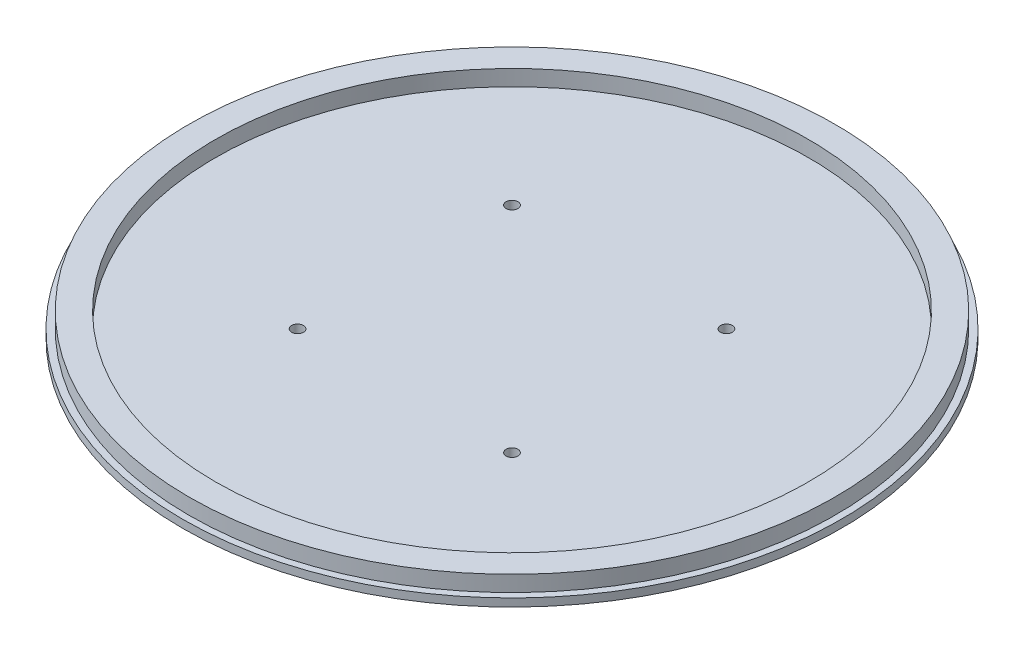
ISO-10303-21;
HEADER;
FILE_DESCRIPTION(('STEP AP214'),'2;1');
FILE_NAME('part.step','',(''),(''),'','','');
FILE_SCHEMA(('AUTOMOTIVE_DESIGN { 1 0 10303 214 1 1 1 1 }'));
ENDSEC;
DATA;
#1=APPLICATION_CONTEXT('core data for automotive mechanical design processes');
#2=APPLICATION_PROTOCOL_DEFINITION('international standard','automotive_design',2000,#1);
#3=PRODUCT_CONTEXT('',#1,'mechanical');
#4=PRODUCT('Part','Part','',(#3));
#5=PRODUCT_RELATED_PRODUCT_CATEGORY('part','',(#4));
#6=PRODUCT_DEFINITION_FORMATION('','',#4);
#7=PRODUCT_DEFINITION_CONTEXT('part definition',#1,'design');
#8=PRODUCT_DEFINITION('design','',#6,#7);
#9=PRODUCT_DEFINITION_SHAPE('','',#8);
#10=(LENGTH_UNIT() NAMED_UNIT(*) SI_UNIT(.MILLI.,.METRE.));
#11=(NAMED_UNIT(*) PLANE_ANGLE_UNIT() SI_UNIT($,.RADIAN.));
#12=(NAMED_UNIT(*) SI_UNIT($,.STERADIAN.) SOLID_ANGLE_UNIT());
#13=UNCERTAINTY_MEASURE_WITH_UNIT(LENGTH_MEASURE(1.E-05),#10,'distance_accuracy_value','');
#14=(GEOMETRIC_REPRESENTATION_CONTEXT(3) GLOBAL_UNCERTAINTY_ASSIGNED_CONTEXT((#13)) GLOBAL_UNIT_ASSIGNED_CONTEXT((#10,
#11,#12)) REPRESENTATION_CONTEXT('',''));
#15=CARTESIAN_POINT('',(0.,0.,0.));
#16=DIRECTION('',(0.,0.,1.));
#17=DIRECTION('',(1.,0.,0.));
#18=AXIS2_PLACEMENT_3D('',#15,#16,#17);
#19=CARTESIAN_POINT('',(0.,0.,0.));
#20=DIRECTION('',(0.,1.,0.));
#21=DIRECTION('',(0.,0.,0.999999999999998));
#22=AXIS2_PLACEMENT_3D('',#19,#20,#21);
#23=PLANE('',#22);
#24=DIRECTION('',(-0.999999999999998,0.,0.));
#25=VECTOR('',#24,1.);
#26=CARTESIAN_POINT('',(0.,0.,16.4160797830999));
#27=LINE('',#26,#25);
#28=CARTESIAN_POINT('',(-91.5160797831002,0.,16.4160797830997));
#29=VERTEX_POINT('',#28);
#30=CARTESIAN_POINT('',(-58.6839202169002,0.,16.4160797831014));
#31=VERTEX_POINT('',#30);
#32=EDGE_CURVE('E237',#29,#31,#27,.F.);
#33=ORIENTED_EDGE('',*,*,#32,.T.);
#34=DIRECTION('',(0.,0.,0.999999999999998));
#35=VECTOR('',#34,1.);
#36=CARTESIAN_POINT('',(-58.6839202169003,0.,8.88178419700125E-13));
#37=LINE('',#36,#35);
#38=CARTESIAN_POINT('',(-58.6839202169005,-9.43689570931383E-13,-16.4160797830979));
#39=VERTEX_POINT('',#38);
#40=EDGE_CURVE('E239',#31,#39,#37,.F.);
#41=ORIENTED_EDGE('',*,*,#40,.T.);
#42=DIRECTION('',(-0.999999999999998,0.,0.));
#43=VECTOR('',#42,1.);
#44=CARTESIAN_POINT('',(-1.66533453693773E-13,-8.88178419700125E-13,-16.4160797830992));
#45=LINE('',#44,#43);
#46=CARTESIAN_POINT('',(-91.5160797830992,-9.43689570931383E-13,-16.4160797830981));
#47=VERTEX_POINT('',#46);
#48=EDGE_CURVE('E220',#39,#47,#45,.T.);
#49=ORIENTED_EDGE('',*,*,#48,.T.);
#50=DIRECTION('',(0.,0.,0.999999999999998));
#51=VECTOR('',#50,1.);
#52=CARTESIAN_POINT('',(-91.5160797831001,-1.66533453693773E-13,1.77635683940025E-12));
#53=LINE('',#52,#51);
#54=EDGE_CURVE('E235',#47,#29,#53,.T.);
#55=ORIENTED_EDGE('',*,*,#54,.T.);
#56=EDGE_LOOP('',(#33,#41,#49,#55));
#57=FACE_BOUND('',#56,.T.);
#58=CARTESIAN_POINT('',(0.,0.,0.));
#59=DIRECTION('',(0.,1.,0.));
#60=DIRECTION('',(0.,0.,0.999999999999998));
#61=AXIS2_PLACEMENT_3D('',#58,#59,#60);
#62=CIRCLE('',#61,125.);
#63=CARTESIAN_POINT('',(0.,0.,125.));
#64=VERTEX_POINT('',#63);
#65=EDGE_CURVE('E193',#64,#64,#62,.T.);
#66=ORIENTED_EDGE('',*,*,#65,.F.);
#67=EDGE_LOOP('',(#66));
#68=FACE_BOUND('',#67,.T.);
#69=DIRECTION('',(0.,0.,-0.999999999999998));
#70=VECTOR('',#69,1.);
#71=CARTESIAN_POINT('',(50.2499999999999,-8.88178419700125E-13,1.78329573330416E-12));
#72=LINE('',#71,#70);
#73=CARTESIAN_POINT('',(50.2499999999996,0.,50.2500000000015));
#74=VERTEX_POINT('',#73);
#75=CARTESIAN_POINT('',(50.25,-9.43689570931383E-13,-50.2499999999995));
#76=VERTEX_POINT('',#75);
#77=EDGE_CURVE('E209',#74,#76,#72,.T.);
#78=ORIENTED_EDGE('',*,*,#77,.T.);
#79=DIRECTION('',(0.999999999999998,0.,0.));
#80=VECTOR('',#79,1.);
#81=CARTESIAN_POINT('',(-47.2499999999999,-8.88178419700125E-13,-50.2499999999983));
#82=LINE('',#81,#80);
#83=CARTESIAN_POINT('',(-50.2499999999999,-8.88178419700125E-13,-50.249999999999));
#84=VERTEX_POINT('',#83);
#85=EDGE_CURVE('E211',#76,#84,#82,.F.);
#86=ORIENTED_EDGE('',*,*,#85,.T.);
#87=DIRECTION('',(0.,0.,-0.999999999999998));
#88=VECTOR('',#87,1.);
#89=CARTESIAN_POINT('',(-50.2500000000002,0.,47.25));
#90=LINE('',#89,#88);
#91=CARTESIAN_POINT('',(-50.2499999999999,0.,50.2500000000001));
#92=VERTEX_POINT('',#91);
#93=EDGE_CURVE('E205',#84,#92,#90,.F.);
#94=ORIENTED_EDGE('',*,*,#93,.T.);
#95=DIRECTION('',(0.999999999999998,0.,0.));
#96=VECTOR('',#95,1.);
#97=CARTESIAN_POINT('',(-1.11022302462516E-13,0.,50.2500000000012));
#98=LINE('',#97,#96);
#99=EDGE_CURVE('E207',#92,#74,#98,.T.);
#100=ORIENTED_EDGE('',*,*,#99,.T.);
#101=EDGE_LOOP('',(#78,#86,#94,#100));
#102=FACE_BOUND('',#101,.T.);
#103=ADVANCED_FACE('F59',(#57,#68,#102),#23,.F.);
#104=CARTESIAN_POINT('',(-2.22044604925031E-13,3.,0.));
#105=DIRECTION('',(0.,-1.,0.));
#106=DIRECTION('',(0.,0.,-0.999999999999998));
#107=AXIS2_PLACEMENT_3D('',#104,#105,#106);
#108=CYLINDRICAL_SURFACE('',#107,125.);
#109=CARTESIAN_POINT('',(-2.22044604925031E-13,3.,0.));
#110=DIRECTION('',(0.,1.,0.));
#111=DIRECTION('',(0.,0.,0.999999999999998));
#112=AXIS2_PLACEMENT_3D('',#109,#110,#111);
#113=CIRCLE('',#112,125.);
#114=CARTESIAN_POINT('',(-2.20309881449055E-13,3.,125.));
#115=VERTEX_POINT('',#114);
#116=EDGE_CURVE('E196',#115,#115,#113,.T.);
#117=ORIENTED_EDGE('',*,*,#116,.F.);
#118=EDGE_LOOP('',(#117));
#119=FACE_BOUND('',#118,.T.);
#120=ORIENTED_EDGE('',*,*,#65,.T.);
#121=EDGE_LOOP('',(#120));
#122=FACE_BOUND('',#121,.T.);
#123=ADVANCED_FACE('F312',(#119,#122),#108,.T.);
#124=CARTESIAN_POINT('',(-2.22044604925031E-13,3.,0.));
#125=DIRECTION('',(0.,1.,0.));
#126=DIRECTION('',(0.,0.,0.999999999999998));
#127=AXIS2_PLACEMENT_3D('',#124,#125,#126);
#128=PLANE('',#127);
#129=CARTESIAN_POINT('',(-2.22044604925031E-13,3.,0.));
#130=DIRECTION('',(0.,1.,0.));
#131=DIRECTION('',(0.,0.,0.999999999999998));
#132=AXIS2_PLACEMENT_3D('',#129,#130,#131);
#133=CIRCLE('',#132,122.5);
#134=CARTESIAN_POINT('',(-2.20344575918574E-13,3.,122.5));
#135=VERTEX_POINT('',#134);
#136=EDGE_CURVE('E189',#135,#135,#133,.T.);
#137=ORIENTED_EDGE('',*,*,#136,.F.);
#138=EDGE_LOOP('',(#137));
#139=FACE_BOUND('',#138,.T.);
#140=ORIENTED_EDGE('',*,*,#116,.T.);
#141=EDGE_LOOP('',(#140));
#142=FACE_BOUND('',#141,.T.);
#143=ADVANCED_FACE('F319',(#139,#142),#128,.T.);
#144=CARTESIAN_POINT('',(2.22044604925031E-13,9.00000000000001,0.));
#145=DIRECTION('',(0.,1.,0.));
#146=DIRECTION('',(0.,0.,0.999999999999998));
#147=AXIS2_PLACEMENT_3D('',#144,#145,#146);
#148=PLANE('',#147);
#149=CARTESIAN_POINT('',(2.22044604925031E-13,9.00000000000001,0.));
#150=DIRECTION('',(0.,1.,0.));
#151=DIRECTION('',(0.,0.,0.999999999999998));
#152=AXIS2_PLACEMENT_3D('',#149,#150,#151);
#153=CIRCLE('',#152,122.5);
#154=CARTESIAN_POINT('',(2.23744633931489E-13,9.00000000000001,122.5));
#155=VERTEX_POINT('',#154);
#156=EDGE_CURVE('E190',#155,#155,#153,.T.);
#157=ORIENTED_EDGE('',*,*,#156,.T.);
#158=EDGE_LOOP('',(#157));
#159=FACE_BOUND('',#158,.T.);
#160=CARTESIAN_POINT('',(2.22044604925031E-13,9.00000000000001,0.));
#161=DIRECTION('',(0.,1.,0.));
#162=DIRECTION('',(0.,0.,0.999999999999998));
#163=AXIS2_PLACEMENT_3D('',#160,#161,#162);
#164=CIRCLE('',#163,112.5);
#165=CARTESIAN_POINT('',(2.2360585605341E-13,9.00000000000001,112.5));
#166=VERTEX_POINT('',#165);
#167=EDGE_CURVE('E170',#166,#166,#164,.T.);
#168=ORIENTED_EDGE('',*,*,#167,.F.);
#169=EDGE_LOOP('',(#168));
#170=FACE_BOUND('',#169,.T.);
#171=ADVANCED_FACE('F475',(#159,#170),#148,.T.);
#172=CARTESIAN_POINT('',(2.22044604925031E-13,9.00000000000001,0.));
#173=DIRECTION('',(0.,-1.,0.));
#174=DIRECTION('',(0.,0.,-0.999999999999998));
#175=AXIS2_PLACEMENT_3D('',#172,#173,#174);
#176=CYLINDRICAL_SURFACE('',#175,122.5);
#177=ORIENTED_EDGE('',*,*,#156,.F.);
#178=EDGE_LOOP('',(#177));
#179=FACE_BOUND('',#178,.T.);
#180=ORIENTED_EDGE('',*,*,#136,.T.);
#181=EDGE_LOOP('',(#180));
#182=FACE_BOUND('',#181,.T.);
#183=ADVANCED_FACE('F467',(#179,#182),#176,.T.);
#184=CARTESIAN_POINT('',(2.22044604925031E-13,9.00000000000001,0.));
#185=DIRECTION('',(0.,-1.,0.));
#186=DIRECTION('',(0.,0.,-0.999999999999998));
#187=AXIS2_PLACEMENT_3D('',#184,#185,#186);
#188=CYLINDRICAL_SURFACE('',#187,112.5);
#189=ORIENTED_EDGE('',*,*,#167,.T.);
#190=EDGE_LOOP('',(#189));
#191=FACE_BOUND('',#190,.T.);
#192=CARTESIAN_POINT('',(-2.22044604925031E-13,3.,0.));
#193=DIRECTION('',(0.,1.,0.));
#194=DIRECTION('',(0.,0.,0.999999999999998));
#195=AXIS2_PLACEMENT_3D('',#192,#193,#194);
#196=CIRCLE('',#195,112.5);
#197=CARTESIAN_POINT('',(-2.20483353796652E-13,3.,112.5));
#198=VERTEX_POINT('',#197);
#199=EDGE_CURVE('E199',#198,#198,#196,.F.);
#200=ORIENTED_EDGE('',*,*,#199,.T.);
#201=EDGE_LOOP('',(#200));
#202=FACE_BOUND('',#201,.T.);
#203=ADVANCED_FACE('F464',(#191,#202),#188,.F.);
#204=CARTESIAN_POINT('',(-40.6600000000003,2.99999999999911,-40.6599999999999));
#205=DIRECTION('',(0.,1.,0.));
#206=DIRECTION('',(0.,0.,0.999999999999998));
#207=AXIS2_PLACEMENT_3D('',#204,#205,#206);
#208=CIRCLE('',#207,2.25);
#209=CARTESIAN_POINT('',(-40.6600000000003,2.99999999999911,-38.4099999999999));
#210=VERTEX_POINT('',#209);
#211=EDGE_CURVE('E522',#210,#210,#208,.T.);
#212=ORIENTED_EDGE('',*,*,#211,.F.);
#213=EDGE_LOOP('',(#212));
#214=FACE_BOUND('',#213,.T.);
#215=CARTESIAN_POINT('',(-40.6600000000001,3.,40.6600000000019));
#216=DIRECTION('',(0.,1.,0.));
#217=DIRECTION('',(0.,0.,0.999999999999998));
#218=AXIS2_PLACEMENT_3D('',#215,#216,#217);
#219=CIRCLE('',#218,2.25);
#220=CARTESIAN_POINT('',(-40.6600000000001,3.,42.9100000000019));
#221=VERTEX_POINT('',#220);
#222=EDGE_CURVE('E526',#221,#221,#219,.T.);
#223=ORIENTED_EDGE('',*,*,#222,.F.);
#224=EDGE_LOOP('',(#223));
#225=FACE_BOUND('',#224,.T.);
#226=CARTESIAN_POINT('',(40.6599999999995,3.,40.6599999999997));
#227=DIRECTION('',(0.,1.,0.));
#228=DIRECTION('',(0.,0.,0.999999999999998));
#229=AXIS2_PLACEMENT_3D('',#226,#227,#228);
#230=CIRCLE('',#229,2.25);
#231=CARTESIAN_POINT('',(40.6599999999995,3.,42.9099999999997));
#232=VERTEX_POINT('',#231);
#233=EDGE_CURVE('E530',#232,#232,#230,.T.);
#234=ORIENTED_EDGE('',*,*,#233,.F.);
#235=EDGE_LOOP('',(#234));
#236=FACE_BOUND('',#235,.T.);
#237=CARTESIAN_POINT('',(40.6599999999999,2.99999999999923,-40.6599999999984));
#238=DIRECTION('',(0.,1.,0.));
#239=DIRECTION('',(0.,0.,0.999999999999998));
#240=AXIS2_PLACEMENT_3D('',#237,#238,#239);
#241=CIRCLE('',#240,2.25);
#242=CARTESIAN_POINT('',(40.6599999999999,2.99999999999923,-38.4099999999984));
#243=VERTEX_POINT('',#242);
#244=EDGE_CURVE('E161',#243,#243,#241,.T.);
#245=ORIENTED_EDGE('',*,*,#244,.F.);
#246=EDGE_LOOP('',(#245));
#247=FACE_BOUND('',#246,.T.);
#248=ORIENTED_EDGE('',*,*,#199,.F.);
#249=EDGE_LOOP('',(#248));
#250=FACE_BOUND('',#249,.T.);
#251=ADVANCED_FACE('F459',(#214,#225,#236,#247,#250),#128,.T.);
#252=CARTESIAN_POINT('',(-47.2499999999997,-8.0000000000009,-47.25));
#253=DIRECTION('',(0.,0.,0.999999999999998));
#254=DIRECTION('',(0.999999999999998,0.,0.));
#255=AXIS2_PLACEMENT_3D('',#252,#253,#254);
#256=PLANE('',#255);
#257=DIRECTION('',(0.,1.,0.));
#258=VECTOR('',#257,1.);
#259=CARTESIAN_POINT('',(-47.2499999999997,-8.0000000000009,-47.25));
#260=LINE('',#259,#258);
#261=CARTESIAN_POINT('',(-47.2499999999997,-8.0000000000009,-47.25));
#262=VERTEX_POINT('',#261);
#263=CARTESIAN_POINT('',(-47.2499999999995,-3.00000000000089,-47.2499999999998));
#264=VERTEX_POINT('',#263);
#265=EDGE_CURVE('E181',#262,#264,#260,.T.);
#266=ORIENTED_EDGE('',*,*,#265,.T.);
#267=DIRECTION('',(0.999999999999998,0.,0.));
#268=VECTOR('',#267,1.);
#269=CARTESIAN_POINT('',(47.25,-3.00000000000095,-47.2499999999993));
#270=LINE('',#269,#268);
#271=CARTESIAN_POINT('',(47.25,-3.00000000000095,-47.2499999999993));
#272=VERTEX_POINT('',#271);
#273=EDGE_CURVE('E168',#264,#272,#270,.T.);
#274=ORIENTED_EDGE('',*,*,#273,.T.);
#275=DIRECTION('',(0.,1.,0.));
#276=VECTOR('',#275,1.);
#277=CARTESIAN_POINT('',(47.2499999999998,-8.00000000000095,-47.2499999999991));
#278=LINE('',#277,#276);
#279=CARTESIAN_POINT('',(47.2499999999998,-8.00000000000095,-47.2499999999991));
#280=VERTEX_POINT('',#279);
#281=EDGE_CURVE('E165',#280,#272,#278,.T.);
#282=ORIENTED_EDGE('',*,*,#281,.F.);
#283=DIRECTION('',(0.999999999999998,0.,0.));
#284=VECTOR('',#283,1.);
#285=CARTESIAN_POINT('',(-47.2499999999997,-8.0000000000009,-47.25));
#286=LINE('',#285,#284);
#287=EDGE_CURVE('E149',#262,#280,#286,.T.);
#288=ORIENTED_EDGE('',*,*,#287,.F.);
#289=EDGE_LOOP('',(#266,#274,#282,#288));
#290=FACE_BOUND('',#289,.T.);
#291=ADVANCED_FACE('F166',(#290),#256,.F.);
#292=CARTESIAN_POINT('',(47.25,-8.00000000000001,47.25));
#293=DIRECTION('',(0.999999999999998,0.,0.));
#294=DIRECTION('',(0.,0.,-0.999999999999998));
#295=AXIS2_PLACEMENT_3D('',#292,#293,#294);
#296=PLANE('',#295);
#297=ORIENTED_EDGE('',*,*,#281,.T.);
#298=DIRECTION('',(0.,0.,-0.999999999999998));
#299=VECTOR('',#298,1.);
#300=CARTESIAN_POINT('',(47.2500000000002,-3.,47.2500000000002));
#301=LINE('',#300,#299);
#302=CARTESIAN_POINT('',(47.2500000000002,-3.,47.2500000000002));
#303=VERTEX_POINT('',#302);
#304=EDGE_CURVE('E214',#272,#303,#301,.F.);
#305=ORIENTED_EDGE('',*,*,#304,.T.);
#306=DIRECTION('',(0.,1.,0.));
#307=VECTOR('',#306,1.);
#308=CARTESIAN_POINT('',(47.25,-8.00000000000001,47.25));
#309=LINE('',#308,#307);
#310=CARTESIAN_POINT('',(47.25,-8.00000000000001,47.25));
#311=VERTEX_POINT('',#310);
#312=EDGE_CURVE('E171',#311,#303,#309,.T.);
#313=ORIENTED_EDGE('',*,*,#312,.F.);
#314=DIRECTION('',(0.,0.,-0.999999999999998));
#315=VECTOR('',#314,1.);
#316=CARTESIAN_POINT('',(47.25,-8.00000000000001,47.25));
#317=LINE('',#316,#315);
#318=EDGE_CURVE('E154',#311,#280,#317,.T.);
#319=ORIENTED_EDGE('',*,*,#318,.T.);
#320=EDGE_LOOP('',(#297,#305,#313,#319));
#321=FACE_BOUND('',#320,.T.);
#322=ADVANCED_FACE('F173',(#321),#296,.T.);
#323=CARTESIAN_POINT('',(-47.25,-8.00000000000001,47.2500000000002));
#324=DIRECTION('',(0.,0.,0.999999999999998));
#325=DIRECTION('',(0.999999999999998,0.,0.));
#326=AXIS2_PLACEMENT_3D('',#323,#324,#325);
#327=PLANE('',#326);
#328=ORIENTED_EDGE('',*,*,#312,.T.);
#329=DIRECTION('',(0.999999999999998,0.,0.));
#330=VECTOR('',#329,1.);
#331=CARTESIAN_POINT('',(-47.2499999999996,-3.,47.25));
#332=LINE('',#331,#330);
#333=CARTESIAN_POINT('',(-47.2499999999996,-3.,47.25));
#334=VERTEX_POINT('',#333);
#335=EDGE_CURVE('E216',#303,#334,#332,.F.);
#336=ORIENTED_EDGE('',*,*,#335,.T.);
#337=DIRECTION('',(0.,1.,0.));
#338=VECTOR('',#337,1.);
#339=CARTESIAN_POINT('',(-47.25,-8.00000000000001,47.2500000000002));
#340=LINE('',#339,#338);
#341=CARTESIAN_POINT('',(-47.25,-8.00000000000001,47.2500000000002));
#342=VERTEX_POINT('',#341);
#343=EDGE_CURVE('E183',#342,#334,#340,.T.);
#344=ORIENTED_EDGE('',*,*,#343,.F.);
#345=DIRECTION('',(0.999999999999998,0.,0.));
#346=VECTOR('',#345,1.);
#347=CARTESIAN_POINT('',(-47.25,-8.00000000000001,47.2500000000002));
#348=LINE('',#347,#346);
#349=EDGE_CURVE('E175',#342,#311,#348,.T.);
#350=ORIENTED_EDGE('',*,*,#349,.T.);
#351=EDGE_LOOP('',(#328,#336,#344,#350));
#352=FACE_BOUND('',#351,.T.);
#353=ADVANCED_FACE('F438',(#352),#327,.T.);
#354=CARTESIAN_POINT('',(-47.25,-8.00000000000001,47.2500000000002));
#355=DIRECTION('',(0.999999999999998,0.,0.));
#356=DIRECTION('',(0.,0.,-0.999999999999998));
#357=AXIS2_PLACEMENT_3D('',#354,#355,#356);
#358=PLANE('',#357);
#359=ORIENTED_EDGE('',*,*,#343,.T.);
#360=DIRECTION('',(0.,0.,-0.999999999999998));
#361=VECTOR('',#360,1.);
#362=CARTESIAN_POINT('',(-47.2499999999995,-3.00000000000089,-47.2499999999998));
#363=LINE('',#362,#361);
#364=EDGE_CURVE('E218',#334,#264,#363,.T.);
#365=ORIENTED_EDGE('',*,*,#364,.T.);
#366=ORIENTED_EDGE('',*,*,#265,.F.);
#367=DIRECTION('',(0.,0.,-0.999999999999998));
#368=VECTOR('',#367,1.);
#369=CARTESIAN_POINT('',(-47.25,-8.00000000000001,47.2500000000002));
#370=LINE('',#369,#368);
#371=EDGE_CURVE('E157',#342,#262,#370,.T.);
#372=ORIENTED_EDGE('',*,*,#371,.F.);
#373=EDGE_LOOP('',(#359,#365,#366,#372));
#374=FACE_BOUND('',#373,.T.);
#375=ADVANCED_FACE('F430',(#374),#358,.F.);
#376=CARTESIAN_POINT('',(0.,-8.00000000000001,0.));
#377=DIRECTION('',(0.,1.,0.));
#378=DIRECTION('',(0.,0.,0.999999999999998));
#379=AXIS2_PLACEMENT_3D('',#376,#377,#378);
#380=PLANE('',#379);
#381=CARTESIAN_POINT('',(-40.6600000000003,-8.0000000000009,-40.6599999999999));
#382=DIRECTION('',(0.,-1.,0.));
#383=DIRECTION('',(0.,0.,-0.999999999999998));
#384=AXIS2_PLACEMENT_3D('',#381,#382,#383);
#385=CIRCLE('',#384,2.25);
#386=CARTESIAN_POINT('',(-40.6600000000003,-8.0000000000009,-42.9099999999999));
#387=VERTEX_POINT('',#386);
#388=EDGE_CURVE('E232',#387,#387,#385,.T.);
#389=ORIENTED_EDGE('',*,*,#388,.F.);
#390=EDGE_LOOP('',(#389));
#391=FACE_BOUND('',#390,.T.);
#392=CARTESIAN_POINT('',(-40.6599999999998,-8.00000000000001,40.6600000000019));
#393=DIRECTION('',(0.,-1.,0.));
#394=DIRECTION('',(0.,0.,-0.999999999999998));
#395=AXIS2_PLACEMENT_3D('',#392,#393,#394);
#396=CIRCLE('',#395,2.25);
#397=CARTESIAN_POINT('',(-40.6599999999998,-8.00000000000001,38.4100000000019));
#398=VERTEX_POINT('',#397);
#399=EDGE_CURVE('E545',#398,#398,#396,.T.);
#400=ORIENTED_EDGE('',*,*,#399,.F.);
#401=EDGE_LOOP('',(#400));
#402=FACE_BOUND('',#401,.T.);
#403=CARTESIAN_POINT('',(40.6599999999996,-8.00000000000001,40.6599999999997));
#404=DIRECTION('',(0.,-1.,0.));
#405=DIRECTION('',(0.,0.,-0.999999999999998));
#406=AXIS2_PLACEMENT_3D('',#403,#404,#405);
#407=CIRCLE('',#406,2.25);
#408=CARTESIAN_POINT('',(40.6599999999996,-8.00000000000001,38.4099999999997));
#409=VERTEX_POINT('',#408);
#410=EDGE_CURVE('E541',#409,#409,#407,.T.);
#411=ORIENTED_EDGE('',*,*,#410,.F.);
#412=EDGE_LOOP('',(#411));
#413=FACE_BOUND('',#412,.T.);
#414=CARTESIAN_POINT('',(40.6600000000002,-8.00000000000079,-40.6599999999986));
#415=DIRECTION('',(0.,-1.,0.));
#416=DIRECTION('',(0.,0.,-0.999999999999998));
#417=AXIS2_PLACEMENT_3D('',#414,#415,#416);
#418=CIRCLE('',#417,2.25);
#419=CARTESIAN_POINT('',(40.6600000000002,-8.00000000000079,-42.9099999999986));
#420=VERTEX_POINT('',#419);
#421=EDGE_CURVE('E536',#420,#420,#418,.T.);
#422=ORIENTED_EDGE('',*,*,#421,.F.);
#423=EDGE_LOOP('',(#422));
#424=FACE_BOUND('',#423,.T.);
#425=ORIENTED_EDGE('',*,*,#287,.T.);
#426=ORIENTED_EDGE('',*,*,#318,.F.);
#427=ORIENTED_EDGE('',*,*,#349,.F.);
#428=ORIENTED_EDGE('',*,*,#371,.T.);
#429=EDGE_LOOP('',(#425,#426,#427,#428));
#430=FACE_BOUND('',#429,.T.);
#431=ADVANCED_FACE('F151',(#391,#402,#413,#424,#430),#380,.F.);
#432=CARTESIAN_POINT('',(40.6600000000002,-8.00000000000079,-40.6599999999986));
#433=DIRECTION('',(0.,-1.,0.));
#434=DIRECTION('',(0.,0.,-0.999999999999998));
#435=AXIS2_PLACEMENT_3D('',#432,#433,#434);
#436=CYLINDRICAL_SURFACE('',#435,2.25);
#437=ORIENTED_EDGE('',*,*,#244,.T.);
#438=EDGE_LOOP('',(#437));
#439=FACE_BOUND('',#438,.T.);
#440=ORIENTED_EDGE('',*,*,#421,.T.);
#441=EDGE_LOOP('',(#440));
#442=FACE_BOUND('',#441,.T.);
#443=ADVANCED_FACE('F414',(#439,#442),#436,.F.);
#444=CARTESIAN_POINT('',(40.6599999999996,-8.00000000000001,40.6599999999997));
#445=DIRECTION('',(0.,-1.,0.));
#446=DIRECTION('',(0.,0.,-0.999999999999998));
#447=AXIS2_PLACEMENT_3D('',#444,#445,#446);
#448=CYLINDRICAL_SURFACE('',#447,2.25);
#449=ORIENTED_EDGE('',*,*,#233,.T.);
#450=EDGE_LOOP('',(#449));
#451=FACE_BOUND('',#450,.T.);
#452=ORIENTED_EDGE('',*,*,#410,.T.);
#453=EDGE_LOOP('',(#452));
#454=FACE_BOUND('',#453,.T.);
#455=ADVANCED_FACE('F405',(#451,#454),#448,.F.);
#456=CARTESIAN_POINT('',(-40.6599999999998,-8.00000000000001,40.6600000000019));
#457=DIRECTION('',(0.,-1.,0.));
#458=DIRECTION('',(0.,0.,-0.999999999999998));
#459=AXIS2_PLACEMENT_3D('',#456,#457,#458);
#460=CYLINDRICAL_SURFACE('',#459,2.25);
#461=ORIENTED_EDGE('',*,*,#222,.T.);
#462=EDGE_LOOP('',(#461));
#463=FACE_BOUND('',#462,.T.);
#464=ORIENTED_EDGE('',*,*,#399,.T.);
#465=EDGE_LOOP('',(#464));
#466=FACE_BOUND('',#465,.T.);
#467=ADVANCED_FACE('F397',(#463,#466),#460,.F.);
#468=CARTESIAN_POINT('',(-40.6600000000003,-8.0000000000009,-40.6599999999999));
#469=DIRECTION('',(0.,-1.,0.));
#470=DIRECTION('',(0.,0.,-0.999999999999998));
#471=AXIS2_PLACEMENT_3D('',#468,#469,#470);
#472=CYLINDRICAL_SURFACE('',#471,2.25);
#473=ORIENTED_EDGE('',*,*,#211,.T.);
#474=EDGE_LOOP('',(#473));
#475=FACE_BOUND('',#474,.T.);
#476=ORIENTED_EDGE('',*,*,#388,.T.);
#477=EDGE_LOOP('',(#476));
#478=FACE_BOUND('',#477,.T.);
#479=ADVANCED_FACE('F336',(#475,#478),#472,.F.);
#480=CARTESIAN_POINT('',(3.88578058618805E-13,-3.,50.250000000001));
#481=DIRECTION('',(0.999999999999998,0.,0.));
#482=DIRECTION('',(0.,0.,-0.999999999999998));
#483=AXIS2_PLACEMENT_3D('',#480,#481,#482);
#484=CYLINDRICAL_SURFACE('',#483,3.);
#485=CARTESIAN_POINT('',(50.2499999999999,-3.,50.2500000000017));
#486=DIRECTION('',(0.707106781186547,0.,-0.707106781186547));
#487=DIRECTION('',(0.707106781186547,0.,0.707106781186547));
#488=AXIS2_PLACEMENT_3D('',#485,#486,#487);
#489=ELLIPSE('',#488,4.24264068711928,3.);
#490=EDGE_CURVE('E226',#74,#303,#489,.F.);
#491=ORIENTED_EDGE('',*,*,#490,.F.);
#492=ORIENTED_EDGE('',*,*,#99,.F.);
#493=CARTESIAN_POINT('',(-50.2499999999994,-3.,50.2500000000001));
#494=DIRECTION('',(0.707106781186547,0.,0.707106781186547));
#495=DIRECTION('',(-0.707106781186547,0.,0.707106781186547));
#496=AXIS2_PLACEMENT_3D('',#493,#494,#495);
#497=ELLIPSE('',#496,4.24264068711929,3.);
#498=EDGE_CURVE('E229',#334,#92,#497,.T.);
#499=ORIENTED_EDGE('',*,*,#498,.F.);
#500=ORIENTED_EDGE('',*,*,#335,.F.);
#501=EDGE_LOOP('',(#491,#492,#499,#500));
#502=FACE_BOUND('',#501,.T.);
#503=ADVANCED_FACE('F332',(#502),#484,.F.);
#504=CARTESIAN_POINT('',(-50.2499999999998,-3.,47.25));
#505=DIRECTION('',(0.,0.,0.999999999999998));
#506=DIRECTION('',(0.999999999999998,0.,0.));
#507=AXIS2_PLACEMENT_3D('',#504,#505,#506);
#508=CYLINDRICAL_SURFACE('',#507,3.);
#509=ORIENTED_EDGE('',*,*,#498,.T.);
#510=ORIENTED_EDGE('',*,*,#93,.F.);
#511=CARTESIAN_POINT('',(-50.2499999999992,-3.00000000000089,-50.249999999999));
#512=DIRECTION('',(-0.707106781186547,0.,0.707106781186547));
#513=DIRECTION('',(0.707106781186547,0.,0.707106781186547));
#514=AXIS2_PLACEMENT_3D('',#511,#512,#513);
#515=ELLIPSE('',#514,4.24264068711928,3.);
#516=EDGE_CURVE('E223',#264,#84,#515,.T.);
#517=ORIENTED_EDGE('',*,*,#516,.F.);
#518=ORIENTED_EDGE('',*,*,#364,.F.);
#519=EDGE_LOOP('',(#509,#510,#517,#518));
#520=FACE_BOUND('',#519,.T.);
#521=ADVANCED_FACE('F328',(#520),#508,.F.);
#522=CARTESIAN_POINT('',(50.2500000000001,-3.00000000000089,1.79023462720806E-12));
#523=DIRECTION('',(0.,0.,-0.999999999999998));
#524=DIRECTION('',(-0.999999999999998,0.,0.));
#525=AXIS2_PLACEMENT_3D('',#522,#523,#524);
#526=CYLINDRICAL_SURFACE('',#525,3.);
#527=ORIENTED_EDGE('',*,*,#490,.T.);
#528=ORIENTED_EDGE('',*,*,#304,.F.);
#529=CARTESIAN_POINT('',(50.2500000000005,-3.00000000000095,-50.2499999999997));
#530=DIRECTION('',(-0.707106781186547,0.,-0.707106781186547));
#531=DIRECTION('',(0.707106781186547,0.,-0.707106781186547));
#532=AXIS2_PLACEMENT_3D('',#529,#530,#531);
#533=ELLIPSE('',#532,4.24264068711929,3.);
#534=EDGE_CURVE('E221',#76,#272,#533,.F.);
#535=ORIENTED_EDGE('',*,*,#534,.F.);
#536=ORIENTED_EDGE('',*,*,#77,.F.);
#537=EDGE_LOOP('',(#527,#528,#535,#536));
#538=FACE_BOUND('',#537,.T.);
#539=ADVANCED_FACE('F308',(#538),#526,.F.);
#540=CARTESIAN_POINT('',(-47.2499999999997,-3.00000000000089,-50.2499999999986));
#541=DIRECTION('',(-0.999999999999998,0.,0.));
#542=DIRECTION('',(0.,0.,0.999999999999998));
#543=AXIS2_PLACEMENT_3D('',#540,#541,#542);
#544=CYLINDRICAL_SURFACE('',#543,3.);
#545=ORIENTED_EDGE('',*,*,#516,.T.);
#546=ORIENTED_EDGE('',*,*,#85,.F.);
#547=ORIENTED_EDGE('',*,*,#534,.T.);
#548=ORIENTED_EDGE('',*,*,#273,.F.);
#549=EDGE_LOOP('',(#545,#546,#547,#548));
#550=FACE_BOUND('',#549,.T.);
#551=ADVANCED_FACE('F298',(#550),#544,.F.);
#552=CARTESIAN_POINT('',(4.9960036108132E-13,-5.,0.));
#553=DIRECTION('',(0.,1.,0.));
#554=DIRECTION('',(0.,0.,0.999999999999998));
#555=AXIS2_PLACEMENT_3D('',#552,#553,#554);
#556=PLANE('',#555);
#557=DIRECTION('',(-0.999999999999998,0.,0.));
#558=VECTOR('',#557,1.);
#559=CARTESIAN_POINT('',(2.22044604925031E-13,-5.,0.137259187001464));
#560=LINE('',#559,#558);
#561=CARTESIAN_POINT('',(-74.9627408129998,-5.00000000000006,0.137259186999923));
#562=VERTEX_POINT('',#561);
#563=CARTESIAN_POINT('',(-75.2372591869994,-5.00000000000006,0.137259187001471));
#564=VERTEX_POINT('',#563);
#565=EDGE_CURVE('E242',#562,#564,#560,.T.);
#566=ORIENTED_EDGE('',*,*,#565,.T.);
#567=DIRECTION('',(0.,0.,0.999999999999998));
#568=VECTOR('',#567,1.);
#569=CARTESIAN_POINT('',(-75.2372591869998,-5.00000000000006,1.55431223447522E-12));
#570=LINE('',#569,#568);
#571=CARTESIAN_POINT('',(-75.2372591869999,-5.00000000000006,-0.137259186999909));
#572=VERTEX_POINT('',#571);
#573=EDGE_CURVE('E255',#564,#572,#570,.F.);
#574=ORIENTED_EDGE('',*,*,#573,.T.);
#575=DIRECTION('',(-0.999999999999998,0.,0.));
#576=VECTOR('',#575,1.);
#577=CARTESIAN_POINT('',(4.44089209850063E-13,-5.,-0.137259186999909));
#578=LINE('',#577,#576);
#579=CARTESIAN_POINT('',(-74.9627408129998,-5.00000000000006,-0.137259186999465));
#580=VERTEX_POINT('',#579);
#581=EDGE_CURVE('E253',#572,#580,#578,.F.);
#582=ORIENTED_EDGE('',*,*,#581,.T.);
#583=DIRECTION('',(0.,0.,0.999999999999998));
#584=VECTOR('',#583,1.);
#585=CARTESIAN_POINT('',(-74.962740813,-5.00000000000006,0.));
#586=LINE('',#585,#584);
#587=EDGE_CURVE('E251',#580,#562,#586,.T.);
#588=ORIENTED_EDGE('',*,*,#587,.T.);
#589=EDGE_LOOP('',(#566,#574,#582,#588));
#590=FACE_BOUND('',#589,.T.);
#591=ADVANCED_FACE('F296',(#590),#556,.F.);
#592=CARTESIAN_POINT('',(-91.5160797831006,-6.00000000000017,10.5000000000008));
#593=DIRECTION('',(0.,0.,0.999999999999998));
#594=DIRECTION('',(0.999999999999998,0.,0.));
#595=AXIS2_PLACEMENT_3D('',#592,#593,#594);
#596=CYLINDRICAL_SURFACE('',#595,6.);
#597=CARTESIAN_POINT('',(-91.5160797830999,-6.00000000000095,-16.4160797830994));
#598=DIRECTION('',(-0.707106781186547,0.,0.707106781186547));
#599=DIRECTION('',(-0.707106781186547,0.,-0.707106781186547));
#600=AXIS2_PLACEMENT_3D('',#597,#598,#599);
#601=ELLIPSE('',#600,8.48528137423857,6.);
#602=CARTESIAN_POINT('',(-88.1480479356303,-1.03448275862167,-13.0480479356294));
#603=VERTEX_POINT('',#602);
#604=EDGE_CURVE('E247',#603,#47,#601,.T.);
#605=ORIENTED_EDGE('',*,*,#604,.F.);
#606=DIRECTION('',(0.,0.,0.999999999999998));
#607=VECTOR('',#606,1.);
#608=CARTESIAN_POINT('',(-88.1480479356307,-1.03448275862089,10.5000000000017));
#609=LINE('',#608,#607);
#610=CARTESIAN_POINT('',(-88.1480479356304,-1.03448275862089,13.0480479356312));
#611=VERTEX_POINT('',#610);
#612=EDGE_CURVE('E258',#603,#611,#609,.T.);
#613=ORIENTED_EDGE('',*,*,#612,.T.);
#614=CARTESIAN_POINT('',(-91.5160797831001,-6.00000000000006,16.4160797830999));
#615=DIRECTION('',(0.707106781186547,0.,0.707106781186547));
#616=DIRECTION('',(-0.707106781186547,0.,0.707106781186547));
#617=AXIS2_PLACEMENT_3D('',#614,#615,#616);
#618=ELLIPSE('',#617,8.48528137423857,6.);
#619=EDGE_CURVE('E224',#29,#611,#618,.F.);
#620=ORIENTED_EDGE('',*,*,#619,.F.);
#621=ORIENTED_EDGE('',*,*,#54,.F.);
#622=EDGE_LOOP('',(#605,#613,#620,#621));
#623=FACE_BOUND('',#622,.T.);
#624=ADVANCED_FACE('F290',(#623),#596,.F.);
#625=CARTESIAN_POINT('',(-85.6000000000004,-6.00000000000017,16.4160797831001));
#626=DIRECTION('',(-0.999999999999998,0.,0.));
#627=DIRECTION('',(0.,0.,0.999999999999998));
#628=AXIS2_PLACEMENT_3D('',#625,#626,#627);
#629=CYLINDRICAL_SURFACE('',#628,6.);
#630=ORIENTED_EDGE('',*,*,#619,.T.);
#631=DIRECTION('',(-0.999999999999998,0.,0.));
#632=VECTOR('',#631,1.);
#633=CARTESIAN_POINT('',(-85.6000000000001,-1.03448275862089,13.0480479356312));
#634=LINE('',#633,#632);
#635=CARTESIAN_POINT('',(-62.0519520643694,-1.03448275862078,13.0480479356308));
#636=VERTEX_POINT('',#635);
#637=EDGE_CURVE('E13',#611,#636,#634,.F.);
#638=ORIENTED_EDGE('',*,*,#637,.T.);
#639=CARTESIAN_POINT('',(-58.6839202169001,-6.00000000000001,16.4160797831012));
#640=DIRECTION('',(-0.707106781186547,0.,0.707106781186547));
#641=DIRECTION('',(-0.707106781186547,0.,-0.707106781186547));
#642=AXIS2_PLACEMENT_3D('',#639,#640,#641);
#643=ELLIPSE('',#642,8.48528137423857,6.);
#644=EDGE_CURVE('E245',#31,#636,#643,.T.);
#645=ORIENTED_EDGE('',*,*,#644,.F.);
#646=ORIENTED_EDGE('',*,*,#32,.F.);
#647=EDGE_LOOP('',(#630,#638,#645,#646));
#648=FACE_BOUND('',#647,.T.);
#649=ADVANCED_FACE('F305',(#648),#629,.F.);
#650=CARTESIAN_POINT('',(-85.6000000000003,-6.00000000000095,-16.4160797830992));
#651=DIRECTION('',(-0.999999999999998,0.,0.));
#652=DIRECTION('',(0.,0.,0.999999999999998));
#653=AXIS2_PLACEMENT_3D('',#650,#651,#652);
#654=CYLINDRICAL_SURFACE('',#653,6.);
#655=CARTESIAN_POINT('',(-58.6839202169005,-6.00000000000095,-16.4160797830979));
#656=DIRECTION('',(-0.707106781186547,0.,-0.707106781186547));
#657=DIRECTION('',(-0.707106781186547,0.,0.707106781186547));
#658=AXIS2_PLACEMENT_3D('',#655,#656,#657);
#659=ELLIPSE('',#658,8.48528137423857,6.);
#660=CARTESIAN_POINT('',(-62.0519520643685,-1.03448275862167,-13.0480479356292));
#661=VERTEX_POINT('',#660);
#662=EDGE_CURVE('E243',#661,#39,#659,.T.);
#663=ORIENTED_EDGE('',*,*,#662,.F.);
#664=DIRECTION('',(-0.999999999999998,0.,0.));
#665=VECTOR('',#664,1.);
#666=CARTESIAN_POINT('',(-85.6000000000005,-1.03448275862167,-13.0480479356294));
#667=LINE('',#666,#665);
#668=EDGE_CURVE('E261',#661,#603,#667,.T.);
#669=ORIENTED_EDGE('',*,*,#668,.T.);
#670=ORIENTED_EDGE('',*,*,#604,.T.);
#671=ORIENTED_EDGE('',*,*,#48,.F.);
#672=EDGE_LOOP('',(#663,#669,#670,#671));
#673=FACE_BOUND('',#672,.T.);
#674=ADVANCED_FACE('F285',(#673),#654,.F.);
#675=CARTESIAN_POINT('',(-58.6839202169,-6.00000000000001,10.5000000000011));
#676=DIRECTION('',(0.,0.,0.999999999999998));
#677=DIRECTION('',(0.999999999999998,0.,0.));
#678=AXIS2_PLACEMENT_3D('',#675,#676,#677);
#679=CYLINDRICAL_SURFACE('',#678,6.);
#680=ORIENTED_EDGE('',*,*,#644,.T.);
#681=DIRECTION('',(0.,0.,0.999999999999998));
#682=VECTOR('',#681,1.);
#683=CARTESIAN_POINT('',(-62.0519520643688,-1.03448275862078,10.5000000000015));
#684=LINE('',#683,#682);
#685=EDGE_CURVE('E68',#636,#661,#684,.F.);
#686=ORIENTED_EDGE('',*,*,#685,.T.);
#687=ORIENTED_EDGE('',*,*,#662,.T.);
#688=ORIENTED_EDGE('',*,*,#40,.F.);
#689=EDGE_LOOP('',(#680,#686,#687,#688));
#690=FACE_BOUND('',#689,.T.);
#691=ADVANCED_FACE('F338',(#690),#679,.F.);
#692=CARTESIAN_POINT('',(-74.9627408130003,18.,10.5000000000017));
#693=DIRECTION('',(0.,0.,0.999999999999998));
#694=DIRECTION('',(0.999999999999998,0.,0.));
#695=AXIS2_PLACEMENT_3D('',#692,#693,#694);
#696=CYLINDRICAL_SURFACE('',#695,23.);
#697=CARTESIAN_POINT('',(-74.9627408130003,18.,-0.13725918699814));
#698=DIRECTION('',(0.707106781186547,0.,0.707106781186547));
#699=DIRECTION('',(-0.707106781186547,0.,0.707106781186547));
#700=AXIS2_PLACEMENT_3D('',#697,#698,#699);
#701=ELLIPSE('',#700,32.5269119345812,23.);
#702=EDGE_CURVE('E267',#661,#580,#701,.F.);
#703=ORIENTED_EDGE('',*,*,#702,.F.);
#704=ORIENTED_EDGE('',*,*,#685,.F.);
#705=CARTESIAN_POINT('',(-74.962740813,18.,0.137259186999923));
#706=DIRECTION('',(-0.707106781186547,0.,0.707106781186547));
#707=DIRECTION('',(-0.707106781186547,0.,-0.707106781186547));
#708=AXIS2_PLACEMENT_3D('',#705,#706,#707);
#709=ELLIPSE('',#708,32.5269119345812,23.);
#710=EDGE_CURVE('E63',#562,#636,#709,.T.);
#711=ORIENTED_EDGE('',*,*,#710,.F.);
#712=ORIENTED_EDGE('',*,*,#587,.F.);
#713=EDGE_LOOP('',(#703,#704,#711,#712));
#714=FACE_BOUND('',#713,.T.);
#715=ADVANCED_FACE('F61',(#714),#696,.T.);
#716=CARTESIAN_POINT('',(-85.5999999999998,18.,0.137259186999916));
#717=DIRECTION('',(-0.999999999999998,0.,0.));
#718=DIRECTION('',(0.,0.,0.999999999999998));
#719=AXIS2_PLACEMENT_3D('',#716,#717,#718);
#720=CYLINDRICAL_SURFACE('',#719,23.);
#721=ORIENTED_EDGE('',*,*,#710,.T.);
#722=ORIENTED_EDGE('',*,*,#637,.F.);
#723=CARTESIAN_POINT('',(-75.237259187,18.,0.1372591870017));
#724=DIRECTION('',(-0.707106781186547,0.,-0.707106781186547));
#725=DIRECTION('',(-0.707106781186547,0.,0.707106781186547));
#726=AXIS2_PLACEMENT_3D('',#723,#724,#725);
#727=ELLIPSE('',#726,32.5269119345812,23.);
#728=EDGE_CURVE('E266',#564,#611,#727,.T.);
#729=ORIENTED_EDGE('',*,*,#728,.F.);
#730=ORIENTED_EDGE('',*,*,#565,.F.);
#731=EDGE_LOOP('',(#721,#722,#729,#730));
#732=FACE_BOUND('',#731,.T.);
#733=ADVANCED_FACE('F277',(#732),#720,.T.);
#734=CARTESIAN_POINT('',(-85.5999999999992,18.,-0.13725918699814));
#735=DIRECTION('',(-0.999999999999998,0.,0.));
#736=DIRECTION('',(0.,0.,0.999999999999998));
#737=AXIS2_PLACEMENT_3D('',#734,#735,#736);
#738=CYLINDRICAL_SURFACE('',#737,23.);
#739=ORIENTED_EDGE('',*,*,#702,.T.);
#740=ORIENTED_EDGE('',*,*,#581,.F.);
#741=CARTESIAN_POINT('',(-75.2372591870003,18.,-0.137259186999916));
#742=DIRECTION('',(-0.707106781186547,0.,0.707106781186547));
#743=DIRECTION('',(-0.707106781186547,0.,-0.707106781186547));
#744=AXIS2_PLACEMENT_3D('',#741,#742,#743);
#745=ELLIPSE('',#744,32.5269119345812,23.);
#746=EDGE_CURVE('E264',#603,#572,#745,.T.);
#747=ORIENTED_EDGE('',*,*,#746,.F.);
#748=ORIENTED_EDGE('',*,*,#668,.F.);
#749=EDGE_LOOP('',(#739,#740,#747,#748));
#750=FACE_BOUND('',#749,.T.);
#751=ADVANCED_FACE('F282',(#750),#738,.T.);
#752=CARTESIAN_POINT('',(-75.2372591869999,18.,10.5000000000008));
#753=DIRECTION('',(0.,0.,0.999999999999998));
#754=DIRECTION('',(0.999999999999998,0.,0.));
#755=AXIS2_PLACEMENT_3D('',#752,#753,#754);
#756=CYLINDRICAL_SURFACE('',#755,23.);
#757=ORIENTED_EDGE('',*,*,#728,.T.);
#758=ORIENTED_EDGE('',*,*,#612,.F.);
#759=ORIENTED_EDGE('',*,*,#746,.T.);
#760=ORIENTED_EDGE('',*,*,#573,.F.);
#761=EDGE_LOOP('',(#757,#758,#759,#760));
#762=FACE_BOUND('',#761,.T.);
#763=ADVANCED_FACE('F293',(#762),#756,.T.);
#764=CLOSED_SHELL('',(#103,#123,#143,#171,#183,#203,#251,#291,#322,#353,#375,#431,#443,#455,
#467,#479,#503,#521,#539,#551,#591,#624,#649,#674,#691,#715,#733,#751,#763));
#765=MANIFOLD_SOLID_BREP('B2',#764);
#766=ADVANCED_BREP_SHAPE_REPRESENTATION('',(#18,#765),#14);
#767=SHAPE_DEFINITION_REPRESENTATION(#9,#766);
ENDSEC;
END-ISO-10303-21;
